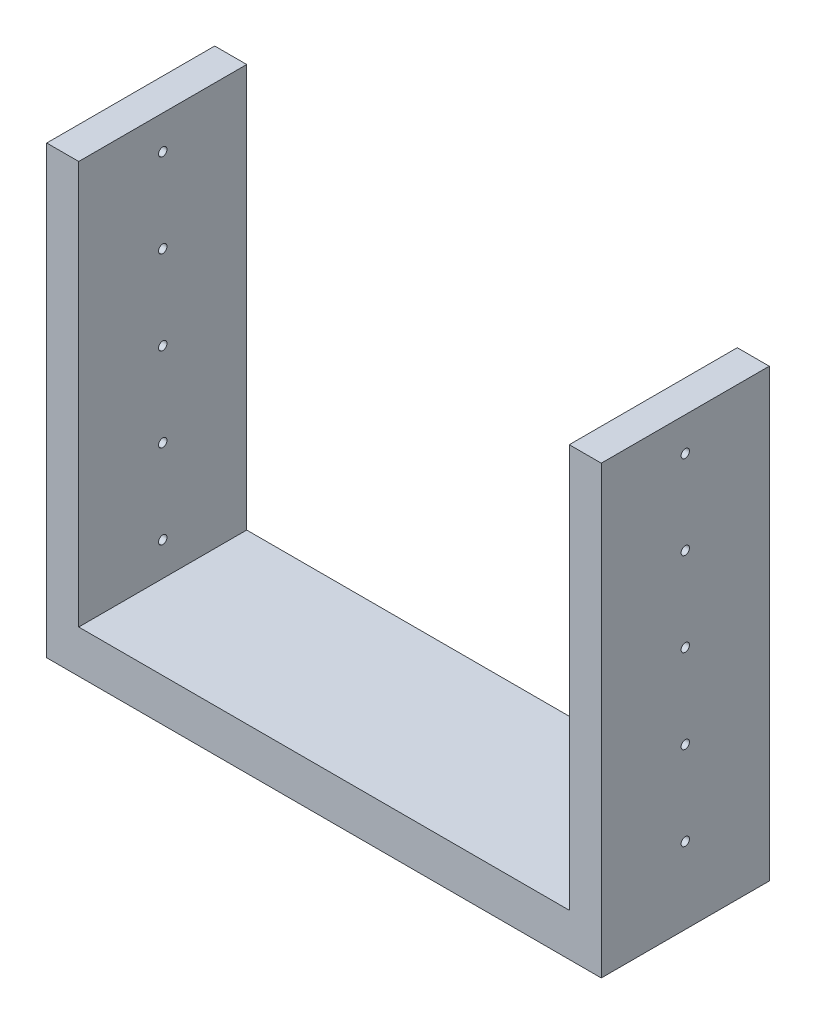
ISO-10303-21;
HEADER;
FILE_DESCRIPTION(('STEP AP214'),'2;1');
FILE_NAME('part.step','',(''),(''),'','','');
FILE_SCHEMA(('AUTOMOTIVE_DESIGN { 1 0 10303 214 1 1 1 1 }'));
ENDSEC;
DATA;
#1=APPLICATION_CONTEXT('core data for automotive mechanical design processes');
#2=APPLICATION_PROTOCOL_DEFINITION('international standard','automotive_design',2000,#1);
#3=PRODUCT_CONTEXT('',#1,'mechanical');
#4=PRODUCT('Part','Part','',(#3));
#5=PRODUCT_RELATED_PRODUCT_CATEGORY('part','',(#4));
#6=PRODUCT_DEFINITION_FORMATION('','',#4);
#7=PRODUCT_DEFINITION_CONTEXT('part definition',#1,'design');
#8=PRODUCT_DEFINITION('design','',#6,#7);
#9=PRODUCT_DEFINITION_SHAPE('','',#8);
#10=(LENGTH_UNIT() NAMED_UNIT(*) SI_UNIT(.MILLI.,.METRE.));
#11=(NAMED_UNIT(*) PLANE_ANGLE_UNIT() SI_UNIT($,.RADIAN.));
#12=(NAMED_UNIT(*) SI_UNIT($,.STERADIAN.) SOLID_ANGLE_UNIT());
#13=UNCERTAINTY_MEASURE_WITH_UNIT(LENGTH_MEASURE(1.E-05),#10,'distance_accuracy_value','');
#14=(GEOMETRIC_REPRESENTATION_CONTEXT(3) GLOBAL_UNCERTAINTY_ASSIGNED_CONTEXT((#13)) GLOBAL_UNIT_ASSIGNED_CONTEXT((#10,
#11,#12)) REPRESENTATION_CONTEXT('',''));
#15=CARTESIAN_POINT('',(0.,0.,0.));
#16=DIRECTION('',(0.,0.,1.));
#17=DIRECTION('',(1.,0.,0.));
#18=AXIS2_PLACEMENT_3D('',#15,#16,#17);
#19=CARTESIAN_POINT('',(-78.,12.7,-25.));
#20=DIRECTION('',(0.,0.,1.));
#21=DIRECTION('',(1.,0.,0.));
#22=AXIS2_PLACEMENT_3D('',#19,#20,#21);
#23=PLANE('',#22);
#24=DIRECTION('',(0.,1.,0.));
#25=VECTOR('',#24,1.);
#26=CARTESIAN_POINT('',(82.525,-50.8991711622105,-25.));
#27=LINE('',#26,#25);
#28=CARTESIAN_POINT('',(82.525,0.,-25.));
#29=VERTEX_POINT('',#28);
#30=CARTESIAN_POINT('',(82.525,132.7,-25.));
#31=VERTEX_POINT('',#30);
#32=EDGE_CURVE('E103',#29,#31,#27,.T.);
#33=ORIENTED_EDGE('',*,*,#32,.F.);
#34=DIRECTION('',(-1.,0.,0.));
#35=VECTOR('',#34,1.);
#36=CARTESIAN_POINT('',(-78.,0.,-25.));
#37=LINE('',#36,#35);
#38=CARTESIAN_POINT('',(-82.525,0.,-25.));
#39=VERTEX_POINT('',#38);
#40=EDGE_CURVE('E160',#29,#39,#37,.T.);
#41=ORIENTED_EDGE('',*,*,#40,.T.);
#42=DIRECTION('',(0.,1.,0.));
#43=VECTOR('',#42,1.);
#44=CARTESIAN_POINT('',(-82.525,-50.8991711622105,-25.));
#45=LINE('',#44,#43);
#46=CARTESIAN_POINT('',(-82.525,132.7,-25.));
#47=VERTEX_POINT('',#46);
#48=EDGE_CURVE('E153',#39,#47,#45,.T.);
#49=ORIENTED_EDGE('',*,*,#48,.T.);
#50=DIRECTION('',(-1.,0.,0.));
#51=VECTOR('',#50,1.);
#52=CARTESIAN_POINT('',(-82.525,132.7,-25.));
#53=LINE('',#52,#51);
#54=CARTESIAN_POINT('',(-73.,132.7,-25.));
#55=VERTEX_POINT('',#54);
#56=EDGE_CURVE('E145',#55,#47,#53,.T.);
#57=ORIENTED_EDGE('',*,*,#56,.F.);
#58=DIRECTION('',(0.,1.,0.));
#59=VECTOR('',#58,1.);
#60=CARTESIAN_POINT('',(-73.,-50.8991711622105,-25.));
#61=LINE('',#60,#59);
#62=CARTESIAN_POINT('',(-73.,12.7,-25.));
#63=VERTEX_POINT('',#62);
#64=EDGE_CURVE('E155',#63,#55,#61,.T.);
#65=ORIENTED_EDGE('',*,*,#64,.F.);
#66=DIRECTION('',(-1.,0.,0.));
#67=VECTOR('',#66,1.);
#68=CARTESIAN_POINT('',(-78.,12.7,-25.));
#69=LINE('',#68,#67);
#70=CARTESIAN_POINT('',(73.,12.7,-25.));
#71=VERTEX_POINT('',#70);
#72=EDGE_CURVE('E40',#71,#63,#69,.T.);
#73=ORIENTED_EDGE('',*,*,#72,.F.);
#74=DIRECTION('',(0.,1.,0.));
#75=VECTOR('',#74,1.);
#76=CARTESIAN_POINT('',(73.,-50.8991711622105,-25.));
#77=LINE('',#76,#75);
#78=CARTESIAN_POINT('',(73.,132.7,-25.));
#79=VERTEX_POINT('',#78);
#80=EDGE_CURVE('E95',#71,#79,#77,.T.);
#81=ORIENTED_EDGE('',*,*,#80,.T.);
#82=DIRECTION('',(-1.,0.,0.));
#83=VECTOR('',#82,1.);
#84=CARTESIAN_POINT('',(82.525,132.7,-25.));
#85=LINE('',#84,#83);
#86=EDGE_CURVE('E99',#31,#79,#85,.T.);
#87=ORIENTED_EDGE('',*,*,#86,.F.);
#88=EDGE_LOOP('',(#33,#41,#49,#57,#65,#73,#81,#87));
#89=FACE_BOUND('',#88,.T.);
#90=ADVANCED_FACE('F32',(#89),#23,.F.);
#91=CARTESIAN_POINT('',(-78.,12.7,25.));
#92=DIRECTION('',(0.,0.,-1.));
#93=DIRECTION('',(-1.,0.,0.));
#94=AXIS2_PLACEMENT_3D('',#91,#92,#93);
#95=PLANE('',#94);
#96=DIRECTION('',(1.,0.,0.));
#97=VECTOR('',#96,1.);
#98=CARTESIAN_POINT('',(-78.,0.,25.));
#99=LINE('',#98,#97);
#100=CARTESIAN_POINT('',(-82.525,0.,25.));
#101=VERTEX_POINT('',#100);
#102=CARTESIAN_POINT('',(82.525,0.,25.));
#103=VERTEX_POINT('',#102);
#104=EDGE_CURVE('E35',#101,#103,#99,.T.);
#105=ORIENTED_EDGE('',*,*,#104,.T.);
#106=DIRECTION('',(0.,1.,0.));
#107=VECTOR('',#106,1.);
#108=CARTESIAN_POINT('',(82.525,-50.8991711622105,25.));
#109=LINE('',#108,#107);
#110=CARTESIAN_POINT('',(82.525,132.7,25.));
#111=VERTEX_POINT('',#110);
#112=EDGE_CURVE('E131',#103,#111,#109,.T.);
#113=ORIENTED_EDGE('',*,*,#112,.T.);
#114=DIRECTION('',(1.,0.,0.));
#115=VECTOR('',#114,1.);
#116=CARTESIAN_POINT('',(82.525,132.7,25.));
#117=LINE('',#116,#115);
#118=CARTESIAN_POINT('',(73.,132.7,25.));
#119=VERTEX_POINT('',#118);
#120=EDGE_CURVE('E113',#119,#111,#117,.T.);
#121=ORIENTED_EDGE('',*,*,#120,.F.);
#122=DIRECTION('',(0.,1.,0.));
#123=VECTOR('',#122,1.);
#124=CARTESIAN_POINT('',(73.,-50.8991711622105,25.));
#125=LINE('',#124,#123);
#126=CARTESIAN_POINT('',(73.0000000000001,12.7,25.));
#127=VERTEX_POINT('',#126);
#128=EDGE_CURVE('E109',#127,#119,#125,.T.);
#129=ORIENTED_EDGE('',*,*,#128,.F.);
#130=DIRECTION('',(1.,0.,0.));
#131=VECTOR('',#130,1.);
#132=CARTESIAN_POINT('',(-78.,12.7,25.));
#133=LINE('',#132,#131);
#134=CARTESIAN_POINT('',(-73.,12.7,25.));
#135=VERTEX_POINT('',#134);
#136=EDGE_CURVE('E11',#135,#127,#133,.T.);
#137=ORIENTED_EDGE('',*,*,#136,.F.);
#138=DIRECTION('',(0.,1.,0.));
#139=VECTOR('',#138,1.);
#140=CARTESIAN_POINT('',(-73.,-50.8991711622105,25.));
#141=LINE('',#140,#139);
#142=CARTESIAN_POINT('',(-73.,132.7,25.));
#143=VERTEX_POINT('',#142);
#144=EDGE_CURVE('E148',#135,#143,#141,.T.);
#145=ORIENTED_EDGE('',*,*,#144,.T.);
#146=DIRECTION('',(1.,0.,0.));
#147=VECTOR('',#146,1.);
#148=CARTESIAN_POINT('',(-82.525,132.7,25.));
#149=LINE('',#148,#147);
#150=CARTESIAN_POINT('',(-82.525,132.7,25.));
#151=VERTEX_POINT('',#150);
#152=EDGE_CURVE('E139',#151,#143,#149,.T.);
#153=ORIENTED_EDGE('',*,*,#152,.F.);
#154=DIRECTION('',(0.,1.,0.));
#155=VECTOR('',#154,1.);
#156=CARTESIAN_POINT('',(-82.525,-50.8991711622105,25.));
#157=LINE('',#156,#155);
#158=EDGE_CURVE('E152',#101,#151,#157,.T.);
#159=ORIENTED_EDGE('',*,*,#158,.F.);
#160=EDGE_LOOP('',(#105,#113,#121,#129,#137,#145,#153,#159));
#161=FACE_BOUND('',#160,.T.);
#162=ADVANCED_FACE('F165',(#161),#95,.F.);
#163=CARTESIAN_POINT('',(0.,12.7,0.));
#164=DIRECTION('',(0.,-1.,0.));
#165=DIRECTION('',(0.,0.,-1.));
#166=AXIS2_PLACEMENT_3D('',#163,#164,#165);
#167=PLANE('',#166);
#168=ORIENTED_EDGE('',*,*,#136,.T.);
#169=DIRECTION('',(0.,0.,-1.));
#170=VECTOR('',#169,1.);
#171=CARTESIAN_POINT('',(73.,12.7,0.));
#172=LINE('',#171,#170);
#173=EDGE_CURVE('E102',#127,#71,#172,.T.);
#174=ORIENTED_EDGE('',*,*,#173,.T.);
#175=ORIENTED_EDGE('',*,*,#72,.T.);
#176=DIRECTION('',(0.,0.,1.));
#177=VECTOR('',#176,1.);
#178=CARTESIAN_POINT('',(-73.,12.7,0.));
#179=LINE('',#178,#177);
#180=EDGE_CURVE('E51',#63,#135,#179,.T.);
#181=ORIENTED_EDGE('',*,*,#180,.T.);
#182=EDGE_LOOP('',(#168,#174,#175,#181));
#183=FACE_BOUND('',#182,.T.);
#184=ADVANCED_FACE('F190',(#183),#167,.F.);
#185=CARTESIAN_POINT('',(0.,0.,0.));
#186=DIRECTION('',(0.,-1.,0.));
#187=DIRECTION('',(0.,0.,-1.));
#188=AXIS2_PLACEMENT_3D('',#185,#186,#187);
#189=PLANE('',#188);
#190=DIRECTION('',(0.,0.,1.));
#191=VECTOR('',#190,1.);
#192=CARTESIAN_POINT('',(-82.525,0.,-25.));
#193=LINE('',#192,#191);
#194=EDGE_CURVE('E149',#39,#101,#193,.T.);
#195=ORIENTED_EDGE('',*,*,#194,.F.);
#196=ORIENTED_EDGE('',*,*,#40,.F.);
#197=DIRECTION('',(0.,0.,-1.));
#198=VECTOR('',#197,1.);
#199=CARTESIAN_POINT('',(82.525,0.,-25.));
#200=LINE('',#199,#198);
#201=EDGE_CURVE('E128',#103,#29,#200,.T.);
#202=ORIENTED_EDGE('',*,*,#201,.F.);
#203=ORIENTED_EDGE('',*,*,#104,.F.);
#204=EDGE_LOOP('',(#195,#196,#202,#203));
#205=FACE_BOUND('',#204,.T.);
#206=ADVANCED_FACE('F169',(#205),#189,.T.);
#207=CARTESIAN_POINT('',(-73.,-50.8991711622105,-25.));
#208=DIRECTION('',(1.,0.,0.));
#209=DIRECTION('',(0.,0.,-1.));
#210=AXIS2_PLACEMENT_3D('',#207,#208,#209);
#211=PLANE('',#210);
#212=CARTESIAN_POINT('',(-73.,22.7,-1.04744440165294E-12));
#213=DIRECTION('',(1.,0.,0.));
#214=DIRECTION('',(0.,0.,-1.));
#215=AXIS2_PLACEMENT_3D('',#212,#213,#214);
#216=CIRCLE('',#215,1.25);
#217=CARTESIAN_POINT('',(-73.,22.7,-1.25000000000105));
#218=VERTEX_POINT('',#217);
#219=EDGE_CURVE('E334',#218,#218,#216,.T.);
#220=ORIENTED_EDGE('',*,*,#219,.F.);
#221=EDGE_LOOP('',(#220));
#222=FACE_BOUND('',#221,.T.);
#223=CARTESIAN_POINT('',(-73.,47.7,-7.85583301239705E-13));
#224=DIRECTION('',(1.,0.,0.));
#225=DIRECTION('',(0.,0.,-1.));
#226=AXIS2_PLACEMENT_3D('',#223,#224,#225);
#227=CIRCLE('',#226,1.25);
#228=CARTESIAN_POINT('',(-73.,47.7,-1.25000000000079));
#229=VERTEX_POINT('',#228);
#230=EDGE_CURVE('E356',#229,#229,#227,.T.);
#231=ORIENTED_EDGE('',*,*,#230,.F.);
#232=EDGE_LOOP('',(#231));
#233=FACE_BOUND('',#232,.T.);
#234=CARTESIAN_POINT('',(-73.,72.7,-5.2372220082647E-13));
#235=DIRECTION('',(1.,0.,0.));
#236=DIRECTION('',(0.,0.,-1.));
#237=AXIS2_PLACEMENT_3D('',#234,#235,#236);
#238=CIRCLE('',#237,1.25);
#239=CARTESIAN_POINT('',(-73.,72.7,-1.25000000000052));
#240=VERTEX_POINT('',#239);
#241=EDGE_CURVE('E368',#240,#240,#238,.T.);
#242=ORIENTED_EDGE('',*,*,#241,.F.);
#243=EDGE_LOOP('',(#242));
#244=FACE_BOUND('',#243,.T.);
#245=CARTESIAN_POINT('',(-73.,97.7,-2.61861100413235E-13));
#246=DIRECTION('',(1.,0.,0.));
#247=DIRECTION('',(0.,0.,-1.));
#248=AXIS2_PLACEMENT_3D('',#245,#246,#247);
#249=CIRCLE('',#248,1.25);
#250=CARTESIAN_POINT('',(-73.,97.7,-1.25000000000026));
#251=VERTEX_POINT('',#250);
#252=EDGE_CURVE('E380',#251,#251,#249,.T.);
#253=ORIENTED_EDGE('',*,*,#252,.F.);
#254=EDGE_LOOP('',(#253));
#255=FACE_BOUND('',#254,.T.);
#256=CARTESIAN_POINT('',(-73.,122.7,0.));
#257=DIRECTION('',(1.,0.,0.));
#258=DIRECTION('',(0.,0.,-1.));
#259=AXIS2_PLACEMENT_3D('',#256,#257,#258);
#260=CIRCLE('',#259,1.25);
#261=CARTESIAN_POINT('',(-73.,122.7,-1.25));
#262=VERTEX_POINT('',#261);
#263=EDGE_CURVE('E119',#262,#262,#260,.T.);
#264=ORIENTED_EDGE('',*,*,#263,.F.);
#265=EDGE_LOOP('',(#264));
#266=FACE_BOUND('',#265,.T.);
#267=ORIENTED_EDGE('',*,*,#180,.F.);
#268=ORIENTED_EDGE('',*,*,#64,.T.);
#269=DIRECTION('',(0.,0.,-1.));
#270=VECTOR('',#269,1.);
#271=CARTESIAN_POINT('',(-73.,132.7,-25.));
#272=LINE('',#271,#270);
#273=EDGE_CURVE('E142',#143,#55,#272,.T.);
#274=ORIENTED_EDGE('',*,*,#273,.F.);
#275=ORIENTED_EDGE('',*,*,#144,.F.);
#276=EDGE_LOOP('',(#267,#268,#274,#275));
#277=FACE_BOUND('',#276,.T.);
#278=ADVANCED_FACE('F197',(#222,#233,#244,#255,#266,#277),#211,.T.);
#279=CARTESIAN_POINT('',(-82.525,-50.8991711622105,-25.));
#280=DIRECTION('',(-1.,0.,0.));
#281=DIRECTION('',(0.,0.,1.));
#282=AXIS2_PLACEMENT_3D('',#279,#280,#281);
#283=PLANE('',#282);
#284=CARTESIAN_POINT('',(-82.525,22.7,-1.04744440165294E-12));
#285=DIRECTION('',(1.,0.,0.));
#286=DIRECTION('',(0.,0.,-1.));
#287=AXIS2_PLACEMENT_3D('',#284,#285,#286);
#288=CIRCLE('',#287,1.25);
#289=CARTESIAN_POINT('',(-82.525,22.7,-1.25000000000105));
#290=VERTEX_POINT('',#289);
#291=EDGE_CURVE('E337',#290,#290,#288,.T.);
#292=ORIENTED_EDGE('',*,*,#291,.T.);
#293=EDGE_LOOP('',(#292));
#294=FACE_BOUND('',#293,.T.);
#295=CARTESIAN_POINT('',(-82.525,47.7,-7.85583301239705E-13));
#296=DIRECTION('',(1.,0.,0.));
#297=DIRECTION('',(0.,0.,-1.));
#298=AXIS2_PLACEMENT_3D('',#295,#296,#297);
#299=CIRCLE('',#298,1.25);
#300=CARTESIAN_POINT('',(-82.525,47.7,-1.25000000000079));
#301=VERTEX_POINT('',#300);
#302=EDGE_CURVE('E348',#301,#301,#299,.T.);
#303=ORIENTED_EDGE('',*,*,#302,.T.);
#304=EDGE_LOOP('',(#303));
#305=FACE_BOUND('',#304,.T.);
#306=CARTESIAN_POINT('',(-82.525,72.7,-5.2372220082647E-13));
#307=DIRECTION('',(1.,0.,0.));
#308=DIRECTION('',(0.,0.,-1.));
#309=AXIS2_PLACEMENT_3D('',#306,#307,#308);
#310=CIRCLE('',#309,1.25);
#311=CARTESIAN_POINT('',(-82.525,72.7,-1.25000000000052));
#312=VERTEX_POINT('',#311);
#313=EDGE_CURVE('E360',#312,#312,#310,.T.);
#314=ORIENTED_EDGE('',*,*,#313,.T.);
#315=EDGE_LOOP('',(#314));
#316=FACE_BOUND('',#315,.T.);
#317=CARTESIAN_POINT('',(-82.525,97.7,-2.61861100413235E-13));
#318=DIRECTION('',(1.,0.,0.));
#319=DIRECTION('',(0.,0.,-1.));
#320=AXIS2_PLACEMENT_3D('',#317,#318,#319);
#321=CIRCLE('',#320,1.25);
#322=CARTESIAN_POINT('',(-82.525,97.7,-1.25000000000026));
#323=VERTEX_POINT('',#322);
#324=EDGE_CURVE('E372',#323,#323,#321,.T.);
#325=ORIENTED_EDGE('',*,*,#324,.T.);
#326=EDGE_LOOP('',(#325));
#327=FACE_BOUND('',#326,.T.);
#328=CARTESIAN_POINT('',(-82.525,122.7,0.));
#329=DIRECTION('',(1.,0.,0.));
#330=DIRECTION('',(0.,0.,-1.));
#331=AXIS2_PLACEMENT_3D('',#328,#329,#330);
#332=CIRCLE('',#331,1.25);
#333=CARTESIAN_POINT('',(-82.525,122.7,-1.25));
#334=VERTEX_POINT('',#333);
#335=EDGE_CURVE('E384',#334,#334,#332,.T.);
#336=ORIENTED_EDGE('',*,*,#335,.T.);
#337=EDGE_LOOP('',(#336));
#338=FACE_BOUND('',#337,.T.);
#339=ORIENTED_EDGE('',*,*,#48,.F.);
#340=ORIENTED_EDGE('',*,*,#194,.T.);
#341=ORIENTED_EDGE('',*,*,#158,.T.);
#342=DIRECTION('',(0.,0.,1.));
#343=VECTOR('',#342,1.);
#344=CARTESIAN_POINT('',(-82.525,132.7,-25.));
#345=LINE('',#344,#343);
#346=EDGE_CURVE('E136',#47,#151,#345,.T.);
#347=ORIENTED_EDGE('',*,*,#346,.F.);
#348=EDGE_LOOP('',(#339,#340,#341,#347));
#349=FACE_BOUND('',#348,.T.);
#350=ADVANCED_FACE('F201',(#294,#305,#316,#327,#338,#349),#283,.T.);
#351=CARTESIAN_POINT('',(0.,132.7,0.));
#352=DIRECTION('',(0.,1.,0.));
#353=DIRECTION('',(0.,0.,1.));
#354=AXIS2_PLACEMENT_3D('',#351,#352,#353);
#355=PLANE('',#354);
#356=ORIENTED_EDGE('',*,*,#346,.T.);
#357=ORIENTED_EDGE('',*,*,#152,.T.);
#358=ORIENTED_EDGE('',*,*,#273,.T.);
#359=ORIENTED_EDGE('',*,*,#56,.T.);
#360=EDGE_LOOP('',(#356,#357,#358,#359));
#361=FACE_BOUND('',#360,.T.);
#362=ADVANCED_FACE('F181',(#361),#355,.T.);
#363=CARTESIAN_POINT('',(73.,-50.8991711622105,-25.));
#364=DIRECTION('',(-1.,0.,0.));
#365=DIRECTION('',(0.,0.,1.));
#366=AXIS2_PLACEMENT_3D('',#363,#364,#365);
#367=PLANE('',#366);
#368=CARTESIAN_POINT('',(73.,22.7,-1.04744440165294E-12));
#369=DIRECTION('',(-1.,0.,0.));
#370=DIRECTION('',(0.,0.,1.));
#371=AXIS2_PLACEMENT_3D('',#368,#369,#370);
#372=CIRCLE('',#371,1.25);
#373=CARTESIAN_POINT('',(73.,22.7,1.24999999999895));
#374=VERTEX_POINT('',#373);
#375=EDGE_CURVE('E338',#374,#374,#372,.T.);
#376=ORIENTED_EDGE('',*,*,#375,.F.);
#377=EDGE_LOOP('',(#376));
#378=FACE_BOUND('',#377,.T.);
#379=CARTESIAN_POINT('',(73.,47.7,-7.85583301239705E-13));
#380=DIRECTION('',(-1.,0.,0.));
#381=DIRECTION('',(0.,0.,1.));
#382=AXIS2_PLACEMENT_3D('',#379,#380,#381);
#383=CIRCLE('',#382,1.25);
#384=CARTESIAN_POINT('',(73.,47.7,1.24999999999921));
#385=VERTEX_POINT('',#384);
#386=EDGE_CURVE('E351',#385,#385,#383,.T.);
#387=ORIENTED_EDGE('',*,*,#386,.F.);
#388=EDGE_LOOP('',(#387));
#389=FACE_BOUND('',#388,.T.);
#390=CARTESIAN_POINT('',(73.,72.7,-5.2372220082647E-13));
#391=DIRECTION('',(-1.,0.,0.));
#392=DIRECTION('',(0.,0.,1.));
#393=AXIS2_PLACEMENT_3D('',#390,#391,#392);
#394=CIRCLE('',#393,1.25);
#395=CARTESIAN_POINT('',(73.,72.7,1.24999999999948));
#396=VERTEX_POINT('',#395);
#397=EDGE_CURVE('E363',#396,#396,#394,.T.);
#398=ORIENTED_EDGE('',*,*,#397,.F.);
#399=EDGE_LOOP('',(#398));
#400=FACE_BOUND('',#399,.T.);
#401=CARTESIAN_POINT('',(73.,97.7,-2.61861100413235E-13));
#402=DIRECTION('',(-1.,0.,0.));
#403=DIRECTION('',(0.,0.,1.));
#404=AXIS2_PLACEMENT_3D('',#401,#402,#403);
#405=CIRCLE('',#404,1.25);
#406=CARTESIAN_POINT('',(73.,97.7,1.24999999999974));
#407=VERTEX_POINT('',#406);
#408=EDGE_CURVE('E375',#407,#407,#405,.T.);
#409=ORIENTED_EDGE('',*,*,#408,.F.);
#410=EDGE_LOOP('',(#409));
#411=FACE_BOUND('',#410,.T.);
#412=CARTESIAN_POINT('',(73.,122.7,0.));
#413=DIRECTION('',(-1.,0.,0.));
#414=DIRECTION('',(0.,0.,1.));
#415=AXIS2_PLACEMENT_3D('',#412,#413,#414);
#416=CIRCLE('',#415,1.25);
#417=CARTESIAN_POINT('',(73.,122.7,1.25));
#418=VERTEX_POINT('',#417);
#419=EDGE_CURVE('E122',#418,#418,#416,.T.);
#420=ORIENTED_EDGE('',*,*,#419,.F.);
#421=EDGE_LOOP('',(#420));
#422=FACE_BOUND('',#421,.T.);
#423=ORIENTED_EDGE('',*,*,#173,.F.);
#424=ORIENTED_EDGE('',*,*,#128,.T.);
#425=DIRECTION('',(0.,0.,1.));
#426=VECTOR('',#425,1.);
#427=CARTESIAN_POINT('',(73.,132.7,-25.));
#428=LINE('',#427,#426);
#429=EDGE_CURVE('E106',#79,#119,#428,.T.);
#430=ORIENTED_EDGE('',*,*,#429,.F.);
#431=ORIENTED_EDGE('',*,*,#80,.F.);
#432=EDGE_LOOP('',(#423,#424,#430,#431));
#433=FACE_BOUND('',#432,.T.);
#434=ADVANCED_FACE('F107',(#378,#389,#400,#411,#422,#433),#367,.T.);
#435=CARTESIAN_POINT('',(82.525,-50.8991711622105,-25.));
#436=DIRECTION('',(1.,0.,0.));
#437=DIRECTION('',(0.,0.,-1.));
#438=AXIS2_PLACEMENT_3D('',#435,#436,#437);
#439=PLANE('',#438);
#440=CARTESIAN_POINT('',(82.525,22.7,-1.04744440165294E-12));
#441=DIRECTION('',(1.,0.,0.));
#442=DIRECTION('',(0.,0.,-1.));
#443=AXIS2_PLACEMENT_3D('',#440,#441,#442);
#444=CIRCLE('',#443,1.25);
#445=CARTESIAN_POINT('',(82.525,22.7,-1.25000000000105));
#446=VERTEX_POINT('',#445);
#447=EDGE_CURVE('E339',#446,#446,#444,.T.);
#448=ORIENTED_EDGE('',*,*,#447,.F.);
#449=EDGE_LOOP('',(#448));
#450=FACE_BOUND('',#449,.T.);
#451=CARTESIAN_POINT('',(82.525,47.7,-7.85583301239705E-13));
#452=DIRECTION('',(1.,0.,0.));
#453=DIRECTION('',(0.,0.,-1.));
#454=AXIS2_PLACEMENT_3D('',#451,#452,#453);
#455=CIRCLE('',#454,1.25);
#456=CARTESIAN_POINT('',(82.525,47.7,-1.25000000000079));
#457=VERTEX_POINT('',#456);
#458=EDGE_CURVE('E347',#457,#457,#455,.T.);
#459=ORIENTED_EDGE('',*,*,#458,.F.);
#460=EDGE_LOOP('',(#459));
#461=FACE_BOUND('',#460,.T.);
#462=CARTESIAN_POINT('',(82.525,72.7,-5.2372220082647E-13));
#463=DIRECTION('',(1.,0.,0.));
#464=DIRECTION('',(0.,0.,-1.));
#465=AXIS2_PLACEMENT_3D('',#462,#463,#464);
#466=CIRCLE('',#465,1.25);
#467=CARTESIAN_POINT('',(82.525,72.7,-1.25000000000052));
#468=VERTEX_POINT('',#467);
#469=EDGE_CURVE('E359',#468,#468,#466,.T.);
#470=ORIENTED_EDGE('',*,*,#469,.F.);
#471=EDGE_LOOP('',(#470));
#472=FACE_BOUND('',#471,.T.);
#473=CARTESIAN_POINT('',(82.525,97.7,-2.61861100413235E-13));
#474=DIRECTION('',(1.,0.,0.));
#475=DIRECTION('',(0.,0.,-1.));
#476=AXIS2_PLACEMENT_3D('',#473,#474,#475);
#477=CIRCLE('',#476,1.25);
#478=CARTESIAN_POINT('',(82.525,97.7,-1.25000000000026));
#479=VERTEX_POINT('',#478);
#480=EDGE_CURVE('E371',#479,#479,#477,.T.);
#481=ORIENTED_EDGE('',*,*,#480,.F.);
#482=EDGE_LOOP('',(#481));
#483=FACE_BOUND('',#482,.T.);
#484=CARTESIAN_POINT('',(82.525,122.7,0.));
#485=DIRECTION('',(1.,0.,0.));
#486=DIRECTION('',(0.,0.,-1.));
#487=AXIS2_PLACEMENT_3D('',#484,#485,#486);
#488=CIRCLE('',#487,1.25);
#489=CARTESIAN_POINT('',(82.525,122.7,-1.25));
#490=VERTEX_POINT('',#489);
#491=EDGE_CURVE('E383',#490,#490,#488,.T.);
#492=ORIENTED_EDGE('',*,*,#491,.F.);
#493=EDGE_LOOP('',(#492));
#494=FACE_BOUND('',#493,.T.);
#495=ORIENTED_EDGE('',*,*,#112,.F.);
#496=ORIENTED_EDGE('',*,*,#201,.T.);
#497=ORIENTED_EDGE('',*,*,#32,.T.);
#498=DIRECTION('',(0.,0.,-1.));
#499=VECTOR('',#498,1.);
#500=CARTESIAN_POINT('',(82.525,132.7,-25.));
#501=LINE('',#500,#499);
#502=EDGE_CURVE('E118',#111,#31,#501,.T.);
#503=ORIENTED_EDGE('',*,*,#502,.F.);
#504=EDGE_LOOP('',(#495,#496,#497,#503));
#505=FACE_BOUND('',#504,.T.);
#506=ADVANCED_FACE('F171',(#450,#461,#472,#483,#494,#505),#439,.T.);
#507=CARTESIAN_POINT('',(0.,132.7,0.));
#508=DIRECTION('',(0.,1.,0.));
#509=DIRECTION('',(0.,0.,1.));
#510=AXIS2_PLACEMENT_3D('',#507,#508,#509);
#511=PLANE('',#510);
#512=ORIENTED_EDGE('',*,*,#86,.T.);
#513=ORIENTED_EDGE('',*,*,#429,.T.);
#514=ORIENTED_EDGE('',*,*,#120,.T.);
#515=ORIENTED_EDGE('',*,*,#502,.T.);
#516=EDGE_LOOP('',(#512,#513,#514,#515));
#517=FACE_BOUND('',#516,.T.);
#518=ADVANCED_FACE('F116',(#517),#511,.T.);
#519=CARTESIAN_POINT('',(-82.525,122.7,0.));
#520=DIRECTION('',(1.,0.,0.));
#521=DIRECTION('',(0.,0.,-1.));
#522=AXIS2_PLACEMENT_3D('',#519,#520,#521);
#523=CYLINDRICAL_SURFACE('',#522,1.25);
#524=ORIENTED_EDGE('',*,*,#419,.T.);
#525=EDGE_LOOP('',(#524));
#526=FACE_BOUND('',#525,.T.);
#527=ORIENTED_EDGE('',*,*,#491,.T.);
#528=EDGE_LOOP('',(#527));
#529=FACE_BOUND('',#528,.T.);
#530=ADVANCED_FACE('F179',(#526,#529),#523,.F.);
#531=ORIENTED_EDGE('',*,*,#263,.T.);
#532=EDGE_LOOP('',(#531));
#533=FACE_BOUND('',#532,.T.);
#534=ORIENTED_EDGE('',*,*,#335,.F.);
#535=EDGE_LOOP('',(#534));
#536=FACE_BOUND('',#535,.T.);
#537=ADVANCED_FACE('F242',(#533,#536),#523,.F.);
#538=CARTESIAN_POINT('',(-82.525,97.7,-2.61861100413235E-13));
#539=DIRECTION('',(1.,0.,0.));
#540=DIRECTION('',(0.,0.,-1.));
#541=AXIS2_PLACEMENT_3D('',#538,#539,#540);
#542=CYLINDRICAL_SURFACE('',#541,1.25);
#543=ORIENTED_EDGE('',*,*,#408,.T.);
#544=EDGE_LOOP('',(#543));
#545=FACE_BOUND('',#544,.T.);
#546=ORIENTED_EDGE('',*,*,#480,.T.);
#547=EDGE_LOOP('',(#546));
#548=FACE_BOUND('',#547,.T.);
#549=ADVANCED_FACE('F252',(#545,#548),#542,.F.);
#550=ORIENTED_EDGE('',*,*,#252,.T.);
#551=EDGE_LOOP('',(#550));
#552=FACE_BOUND('',#551,.T.);
#553=ORIENTED_EDGE('',*,*,#324,.F.);
#554=EDGE_LOOP('',(#553));
#555=FACE_BOUND('',#554,.T.);
#556=ADVANCED_FACE('F261',(#552,#555),#542,.F.);
#557=CARTESIAN_POINT('',(-82.525,72.7,-5.2372220082647E-13));
#558=DIRECTION('',(1.,0.,0.));
#559=DIRECTION('',(0.,0.,-1.));
#560=AXIS2_PLACEMENT_3D('',#557,#558,#559);
#561=CYLINDRICAL_SURFACE('',#560,1.25);
#562=ORIENTED_EDGE('',*,*,#397,.T.);
#563=EDGE_LOOP('',(#562));
#564=FACE_BOUND('',#563,.T.);
#565=ORIENTED_EDGE('',*,*,#469,.T.);
#566=EDGE_LOOP('',(#565));
#567=FACE_BOUND('',#566,.T.);
#568=ADVANCED_FACE('F271',(#564,#567),#561,.F.);
#569=ORIENTED_EDGE('',*,*,#241,.T.);
#570=EDGE_LOOP('',(#569));
#571=FACE_BOUND('',#570,.T.);
#572=ORIENTED_EDGE('',*,*,#313,.F.);
#573=EDGE_LOOP('',(#572));
#574=FACE_BOUND('',#573,.T.);
#575=ADVANCED_FACE('F280',(#571,#574),#561,.F.);
#576=CARTESIAN_POINT('',(-82.525,47.7,-7.85583301239705E-13));
#577=DIRECTION('',(1.,0.,0.));
#578=DIRECTION('',(0.,0.,-1.));
#579=AXIS2_PLACEMENT_3D('',#576,#577,#578);
#580=CYLINDRICAL_SURFACE('',#579,1.25);
#581=ORIENTED_EDGE('',*,*,#386,.T.);
#582=EDGE_LOOP('',(#581));
#583=FACE_BOUND('',#582,.T.);
#584=ORIENTED_EDGE('',*,*,#458,.T.);
#585=EDGE_LOOP('',(#584));
#586=FACE_BOUND('',#585,.T.);
#587=ADVANCED_FACE('F290',(#583,#586),#580,.F.);
#588=ORIENTED_EDGE('',*,*,#230,.T.);
#589=EDGE_LOOP('',(#588));
#590=FACE_BOUND('',#589,.T.);
#591=ORIENTED_EDGE('',*,*,#302,.F.);
#592=EDGE_LOOP('',(#591));
#593=FACE_BOUND('',#592,.T.);
#594=ADVANCED_FACE('F299',(#590,#593),#580,.F.);
#595=CARTESIAN_POINT('',(-82.525,22.7,-1.04744440165294E-12));
#596=DIRECTION('',(1.,0.,0.));
#597=DIRECTION('',(0.,0.,-1.));
#598=AXIS2_PLACEMENT_3D('',#595,#596,#597);
#599=CYLINDRICAL_SURFACE('',#598,1.25);
#600=ORIENTED_EDGE('',*,*,#375,.T.);
#601=EDGE_LOOP('',(#600));
#602=FACE_BOUND('',#601,.T.);
#603=ORIENTED_EDGE('',*,*,#447,.T.);
#604=EDGE_LOOP('',(#603));
#605=FACE_BOUND('',#604,.T.);
#606=ADVANCED_FACE('F309',(#602,#605),#599,.F.);
#607=ORIENTED_EDGE('',*,*,#219,.T.);
#608=EDGE_LOOP('',(#607));
#609=FACE_BOUND('',#608,.T.);
#610=ORIENTED_EDGE('',*,*,#291,.F.);
#611=EDGE_LOOP('',(#610));
#612=FACE_BOUND('',#611,.T.);
#613=ADVANCED_FACE('F318',(#609,#612),#599,.F.);
#614=CLOSED_SHELL('',(#90,#162,#184,#206,#278,#350,#362,#434,#506,#518,#530,#537,#549,#556,#568,
#575,#587,#594,#606,#613));
#615=MANIFOLD_SOLID_BREP('B2',#614);
#616=ADVANCED_BREP_SHAPE_REPRESENTATION('',(#18,#615),#14);
#617=SHAPE_DEFINITION_REPRESENTATION(#9,#616);
ENDSEC;
END-ISO-10303-21;
